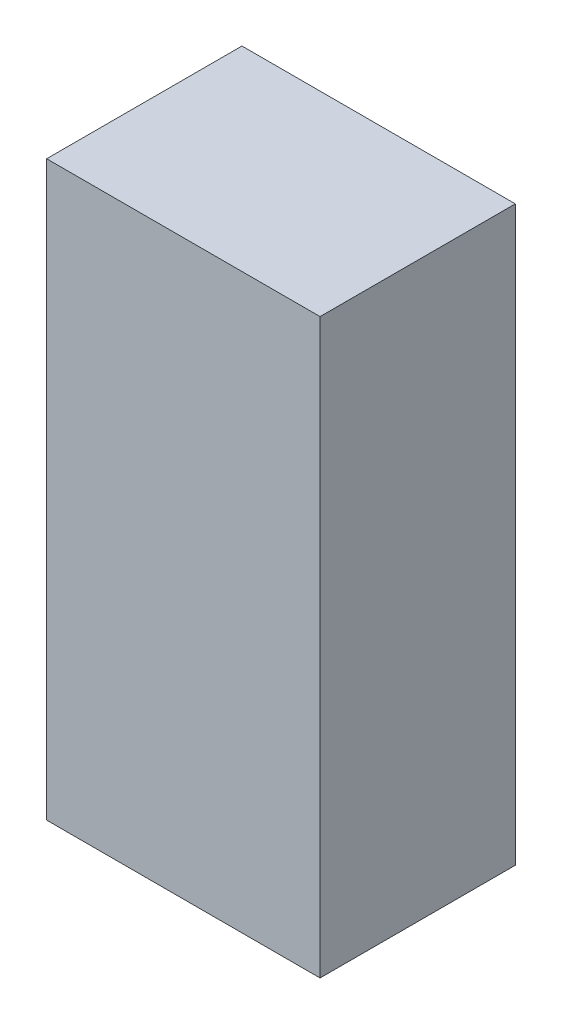
ISO-10303-21;
HEADER;
FILE_DESCRIPTION(('STEP AP214'),'2;1');
FILE_NAME('part.step','',(''),(''),'','','');
FILE_SCHEMA(('AUTOMOTIVE_DESIGN { 1 0 10303 214 1 1 1 1 }'));
ENDSEC;
DATA;
#1=APPLICATION_CONTEXT('core data for automotive mechanical design processes');
#2=APPLICATION_PROTOCOL_DEFINITION('international standard','automotive_design',2000,#1);
#3=PRODUCT_CONTEXT('',#1,'mechanical');
#4=PRODUCT('Part','Part','',(#3));
#5=PRODUCT_RELATED_PRODUCT_CATEGORY('part','',(#4));
#6=PRODUCT_DEFINITION_FORMATION('','',#4);
#7=PRODUCT_DEFINITION_CONTEXT('part definition',#1,'design');
#8=PRODUCT_DEFINITION('design','',#6,#7);
#9=PRODUCT_DEFINITION_SHAPE('','',#8);
#10=(LENGTH_UNIT() NAMED_UNIT(*) SI_UNIT(.MILLI.,.METRE.));
#11=(NAMED_UNIT(*) PLANE_ANGLE_UNIT() SI_UNIT($,.RADIAN.));
#12=(NAMED_UNIT(*) SI_UNIT($,.STERADIAN.) SOLID_ANGLE_UNIT());
#13=UNCERTAINTY_MEASURE_WITH_UNIT(LENGTH_MEASURE(1.E-05),#10,'distance_accuracy_value','');
#14=(GEOMETRIC_REPRESENTATION_CONTEXT(3) GLOBAL_UNCERTAINTY_ASSIGNED_CONTEXT((#13)) GLOBAL_UNIT_ASSIGNED_CONTEXT((#10,
#11,#12)) REPRESENTATION_CONTEXT('',''));
#15=CARTESIAN_POINT('',(0.,0.,0.));
#16=DIRECTION('',(0.,0.,1.));
#17=DIRECTION('',(1.,0.,0.));
#18=AXIS2_PLACEMENT_3D('',#15,#16,#17);
#19=CARTESIAN_POINT('',(0.,44.,15.));
#20=DIRECTION('',(1.,0.,0.));
#21=DIRECTION('',(0.,0.,-1.));
#22=AXIS2_PLACEMENT_3D('',#19,#20,#21);
#23=PLANE('',#22);
#24=DIRECTION('',(0.,-1.,0.));
#25=VECTOR('',#24,1.);
#26=CARTESIAN_POINT('',(0.,44.,0.));
#27=LINE('',#26,#25);
#28=CARTESIAN_POINT('',(0.,44.,0.));
#29=VERTEX_POINT('',#28);
#30=CARTESIAN_POINT('',(0.,0.,0.));
#31=VERTEX_POINT('',#30);
#32=EDGE_CURVE('E102',#29,#31,#27,.T.);
#33=ORIENTED_EDGE('',*,*,#32,.T.);
#34=DIRECTION('',(0.,0.,-1.));
#35=VECTOR('',#34,1.);
#36=CARTESIAN_POINT('',(0.,0.,15.));
#37=LINE('',#36,#35);
#38=CARTESIAN_POINT('',(0.,0.,15.));
#39=VERTEX_POINT('',#38);
#40=EDGE_CURVE('E11',#39,#31,#37,.T.);
#41=ORIENTED_EDGE('',*,*,#40,.F.);
#42=DIRECTION('',(0.,-1.,0.));
#43=VECTOR('',#42,1.);
#44=CARTESIAN_POINT('',(0.,44.,15.));
#45=LINE('',#44,#43);
#46=CARTESIAN_POINT('',(0.,44.,15.));
#47=VERTEX_POINT('',#46);
#48=EDGE_CURVE('E90',#47,#39,#45,.T.);
#49=ORIENTED_EDGE('',*,*,#48,.F.);
#50=DIRECTION('',(0.,0.,-1.));
#51=VECTOR('',#50,1.);
#52=CARTESIAN_POINT('',(0.,44.,15.));
#53=LINE('',#52,#51);
#54=EDGE_CURVE('E98',#47,#29,#53,.T.);
#55=ORIENTED_EDGE('',*,*,#54,.T.);
#56=EDGE_LOOP('',(#33,#41,#49,#55));
#57=FACE_BOUND('',#56,.T.);
#58=ADVANCED_FACE('F39',(#57),#23,.F.);
#59=CARTESIAN_POINT('',(0.,0.,15.));
#60=DIRECTION('',(0.,1.,0.));
#61=DIRECTION('',(0.,0.,1.));
#62=AXIS2_PLACEMENT_3D('',#59,#60,#61);
#63=PLANE('',#62);
#64=DIRECTION('',(1.,0.,0.));
#65=VECTOR('',#64,1.);
#66=CARTESIAN_POINT('',(0.,0.,0.));
#67=LINE('',#66,#65);
#68=CARTESIAN_POINT('',(21.,0.,0.));
#69=VERTEX_POINT('',#68);
#70=EDGE_CURVE('E94',#31,#69,#67,.T.);
#71=ORIENTED_EDGE('',*,*,#70,.T.);
#72=DIRECTION('',(0.,0.,-1.));
#73=VECTOR('',#72,1.);
#74=CARTESIAN_POINT('',(21.,0.,15.));
#75=LINE('',#74,#73);
#76=CARTESIAN_POINT('',(21.,0.,15.));
#77=VERTEX_POINT('',#76);
#78=EDGE_CURVE('E47',#77,#69,#75,.T.);
#79=ORIENTED_EDGE('',*,*,#78,.F.);
#80=DIRECTION('',(1.,0.,0.));
#81=VECTOR('',#80,1.);
#82=CARTESIAN_POINT('',(0.,0.,15.));
#83=LINE('',#82,#81);
#84=EDGE_CURVE('E85',#39,#77,#83,.T.);
#85=ORIENTED_EDGE('',*,*,#84,.F.);
#86=ORIENTED_EDGE('',*,*,#40,.T.);
#87=EDGE_LOOP('',(#71,#79,#85,#86));
#88=FACE_BOUND('',#87,.T.);
#89=ADVANCED_FACE('F93',(#88),#63,.F.);
#90=CARTESIAN_POINT('',(21.,0.,15.));
#91=DIRECTION('',(-1.,0.,0.));
#92=DIRECTION('',(0.,0.,1.));
#93=AXIS2_PLACEMENT_3D('',#90,#91,#92);
#94=PLANE('',#93);
#95=DIRECTION('',(0.,1.,0.));
#96=VECTOR('',#95,1.);
#97=CARTESIAN_POINT('',(21.,0.,0.));
#98=LINE('',#97,#96);
#99=CARTESIAN_POINT('',(21.,44.,0.));
#100=VERTEX_POINT('',#99);
#101=EDGE_CURVE('E72',#69,#100,#98,.T.);
#102=ORIENTED_EDGE('',*,*,#101,.T.);
#103=DIRECTION('',(0.,0.,-1.));
#104=VECTOR('',#103,1.);
#105=CARTESIAN_POINT('',(21.,44.,15.));
#106=LINE('',#105,#104);
#107=CARTESIAN_POINT('',(21.,44.,15.));
#108=VERTEX_POINT('',#107);
#109=EDGE_CURVE('E95',#108,#100,#106,.T.);
#110=ORIENTED_EDGE('',*,*,#109,.F.);
#111=DIRECTION('',(0.,1.,0.));
#112=VECTOR('',#111,1.);
#113=CARTESIAN_POINT('',(21.,0.,15.));
#114=LINE('',#113,#112);
#115=EDGE_CURVE('E88',#77,#108,#114,.T.);
#116=ORIENTED_EDGE('',*,*,#115,.F.);
#117=ORIENTED_EDGE('',*,*,#78,.T.);
#118=EDGE_LOOP('',(#102,#110,#116,#117));
#119=FACE_BOUND('',#118,.T.);
#120=ADVANCED_FACE('F96',(#119),#94,.F.);
#121=CARTESIAN_POINT('',(21.,44.,15.));
#122=DIRECTION('',(0.,-1.,0.));
#123=DIRECTION('',(0.,0.,-1.));
#124=AXIS2_PLACEMENT_3D('',#121,#122,#123);
#125=PLANE('',#124);
#126=DIRECTION('',(-1.,0.,0.));
#127=VECTOR('',#126,1.);
#128=CARTESIAN_POINT('',(21.,44.,0.));
#129=LINE('',#128,#127);
#130=EDGE_CURVE('E78',#100,#29,#129,.T.);
#131=ORIENTED_EDGE('',*,*,#130,.T.);
#132=ORIENTED_EDGE('',*,*,#54,.F.);
#133=DIRECTION('',(-1.,0.,0.));
#134=VECTOR('',#133,1.);
#135=CARTESIAN_POINT('',(21.,44.,15.));
#136=LINE('',#135,#134);
#137=EDGE_CURVE('E55',#108,#47,#136,.T.);
#138=ORIENTED_EDGE('',*,*,#137,.F.);
#139=ORIENTED_EDGE('',*,*,#109,.T.);
#140=EDGE_LOOP('',(#131,#132,#138,#139));
#141=FACE_BOUND('',#140,.T.);
#142=ADVANCED_FACE('F109',(#141),#125,.F.);
#143=CARTESIAN_POINT('',(0.,0.,15.));
#144=DIRECTION('',(0.,0.,1.));
#145=DIRECTION('',(1.,0.,0.));
#146=AXIS2_PLACEMENT_3D('',#143,#144,#145);
#147=PLANE('',#146);
#148=ORIENTED_EDGE('',*,*,#48,.T.);
#149=ORIENTED_EDGE('',*,*,#84,.T.);
#150=ORIENTED_EDGE('',*,*,#115,.T.);
#151=ORIENTED_EDGE('',*,*,#137,.T.);
#152=EDGE_LOOP('',(#148,#149,#150,#151));
#153=FACE_BOUND('',#152,.T.);
#154=ADVANCED_FACE('F86',(#153),#147,.T.);
#155=CARTESIAN_POINT('',(0.,0.,0.));
#156=DIRECTION('',(0.,0.,1.));
#157=DIRECTION('',(1.,0.,0.));
#158=AXIS2_PLACEMENT_3D('',#155,#156,#157);
#159=PLANE('',#158);
#160=ORIENTED_EDGE('',*,*,#32,.F.);
#161=ORIENTED_EDGE('',*,*,#130,.F.);
#162=ORIENTED_EDGE('',*,*,#101,.F.);
#163=ORIENTED_EDGE('',*,*,#70,.F.);
#164=EDGE_LOOP('',(#160,#161,#162,#163));
#165=FACE_BOUND('',#164,.T.);
#166=ADVANCED_FACE('F112',(#165),#159,.F.);
#167=CLOSED_SHELL('',(#58,#89,#120,#142,#154,#166));
#168=MANIFOLD_SOLID_BREP('B2',#167);
#169=ADVANCED_BREP_SHAPE_REPRESENTATION('',(#18,#168),#14);
#170=SHAPE_DEFINITION_REPRESENTATION(#9,#169);
ENDSEC;
END-ISO-10303-21;
